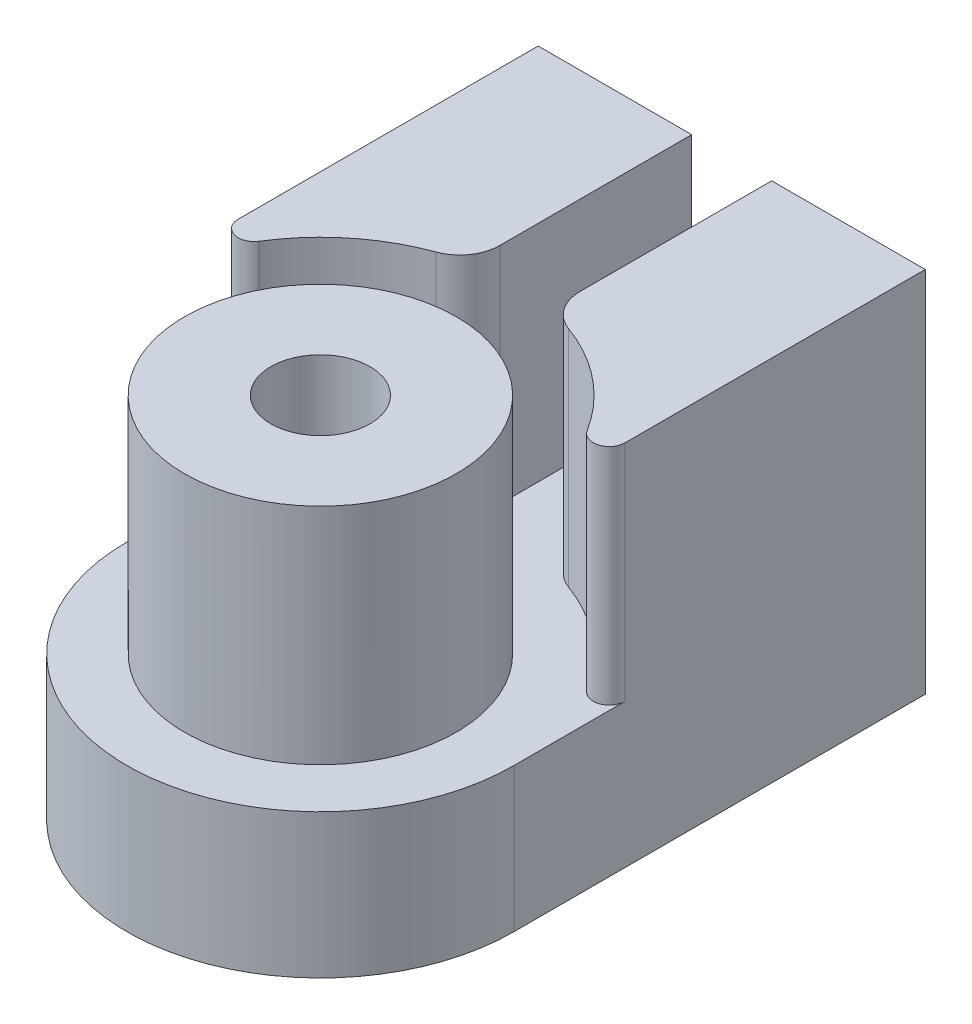
ISO-10303-21;
HEADER;
FILE_DESCRIPTION(('STEP AP214'),'2;1');
FILE_NAME('part.step','',(''),(''),'','','');
FILE_SCHEMA(('AUTOMOTIVE_DESIGN { 1 0 10303 214 1 1 1 1 }'));
ENDSEC;
DATA;
#1=APPLICATION_CONTEXT('core data for automotive mechanical design processes');
#2=APPLICATION_PROTOCOL_DEFINITION('international standard','automotive_design',2000,#1);
#3=PRODUCT_CONTEXT('',#1,'mechanical');
#4=PRODUCT('Part','Part','',(#3));
#5=PRODUCT_RELATED_PRODUCT_CATEGORY('part','',(#4));
#6=PRODUCT_DEFINITION_FORMATION('','',#4);
#7=PRODUCT_DEFINITION_CONTEXT('part definition',#1,'design');
#8=PRODUCT_DEFINITION('design','',#6,#7);
#9=PRODUCT_DEFINITION_SHAPE('','',#8);
#10=(LENGTH_UNIT() NAMED_UNIT(*) SI_UNIT(.MILLI.,.METRE.));
#11=(NAMED_UNIT(*) PLANE_ANGLE_UNIT() SI_UNIT($,.RADIAN.));
#12=(NAMED_UNIT(*) SI_UNIT($,.STERADIAN.) SOLID_ANGLE_UNIT());
#13=UNCERTAINTY_MEASURE_WITH_UNIT(LENGTH_MEASURE(1.E-05),#10,'distance_accuracy_value','');
#14=(GEOMETRIC_REPRESENTATION_CONTEXT(3) GLOBAL_UNCERTAINTY_ASSIGNED_CONTEXT((#13)) GLOBAL_UNIT_ASSIGNED_CONTEXT((#10,
#11,#12)) REPRESENTATION_CONTEXT('',''));
#15=CARTESIAN_POINT('',(0.,0.,0.));
#16=DIRECTION('',(0.,0.,1.));
#17=DIRECTION('',(1.,0.,0.));
#18=AXIS2_PLACEMENT_3D('',#15,#16,#17);
#19=CARTESIAN_POINT('',(-2.5,7.,-6.8585712797929));
#20=DIRECTION('',(0.,-1.,0.));
#21=DIRECTION('',(0.,0.,-1.));
#22=AXIS2_PLACEMENT_3D('',#19,#20,#21);
#23=CYLINDRICAL_SURFACE('',#22,1.25);
#24=CARTESIAN_POINT('',(-2.5,0.,-6.8585712797929));
#25=DIRECTION('',(0.,1.,0.));
#26=DIRECTION('',(0.,0.,1.));
#27=AXIS2_PLACEMENT_3D('',#24,#25,#26);
#28=CIRCLE('',#27,1.25);
#29=CARTESIAN_POINT('',(-1.25,0.,-6.8585712797929));
#30=VERTEX_POINT('',#29);
#31=CARTESIAN_POINT('',(-2.07191780821918,0.,-5.6841583894174));
#32=VERTEX_POINT('',#31);
#33=EDGE_CURVE('E241',#30,#32,#28,.F.);
#34=ORIENTED_EDGE('',*,*,#33,.F.);
#35=DIRECTION('',(0.,-1.,0.));
#36=VECTOR('',#35,1.);
#37=CARTESIAN_POINT('',(-1.25,7.,-6.8585712797929));
#38=LINE('',#37,#36);
#39=CARTESIAN_POINT('',(-1.25,7.,-6.8585712797929));
#40=VERTEX_POINT('',#39);
#41=EDGE_CURVE('E270',#40,#30,#38,.T.);
#42=ORIENTED_EDGE('',*,*,#41,.F.);
#43=CARTESIAN_POINT('',(-2.5,7.,-6.8585712797929));
#44=DIRECTION('',(0.,1.,0.));
#45=DIRECTION('',(0.,0.,1.));
#46=AXIS2_PLACEMENT_3D('',#43,#44,#45);
#47=CIRCLE('',#46,1.25);
#48=CARTESIAN_POINT('',(-2.07191780821918,7.,-5.6841583894174));
#49=VERTEX_POINT('',#48);
#50=EDGE_CURVE('E242',#40,#49,#47,.F.);
#51=ORIENTED_EDGE('',*,*,#50,.T.);
#52=DIRECTION('',(0.,-1.,0.));
#53=VECTOR('',#52,1.);
#54=CARTESIAN_POINT('',(-2.07191780821918,7.,-5.6841583894174));
#55=LINE('',#54,#53);
#56=EDGE_CURVE('E256',#49,#32,#55,.T.);
#57=ORIENTED_EDGE('',*,*,#56,.T.);
#58=EDGE_LOOP('',(#34,#42,#51,#57));
#59=FACE_BOUND('',#58,.T.);
#60=ADVANCED_FACE('F72',(#59),#23,.T.);
#61=CARTESIAN_POINT('',(-1.25,7.,0.));
#62=DIRECTION('',(-1.,0.,0.));
#63=DIRECTION('',(0.,0.,1.));
#64=AXIS2_PLACEMENT_3D('',#61,#62,#63);
#65=PLANE('',#64);
#66=DIRECTION('',(0.,0.,-1.));
#67=VECTOR('',#66,1.);
#68=CARTESIAN_POINT('',(-1.25,0.,0.));
#69=LINE('',#68,#67);
#70=CARTESIAN_POINT('',(-1.25,0.,-12.8585712797929));
#71=VERTEX_POINT('',#70);
#72=EDGE_CURVE('E258',#30,#71,#69,.T.);
#73=ORIENTED_EDGE('',*,*,#72,.T.);
#74=DIRECTION('',(0.,-1.,0.));
#75=VECTOR('',#74,1.);
#76=CARTESIAN_POINT('',(-1.25,7.,-12.8585712797929));
#77=LINE('',#76,#75);
#78=CARTESIAN_POINT('',(-1.25,7.,-12.8585712797929));
#79=VERTEX_POINT('',#78);
#80=EDGE_CURVE('E267',#79,#71,#77,.T.);
#81=ORIENTED_EDGE('',*,*,#80,.F.);
#82=DIRECTION('',(0.,0.,-1.));
#83=VECTOR('',#82,1.);
#84=CARTESIAN_POINT('',(-1.25,7.,0.));
#85=LINE('',#84,#83);
#86=EDGE_CURVE('E245',#40,#79,#85,.T.);
#87=ORIENTED_EDGE('',*,*,#86,.F.);
#88=ORIENTED_EDGE('',*,*,#41,.T.);
#89=EDGE_LOOP('',(#73,#81,#87,#88));
#90=FACE_BOUND('',#89,.T.);
#91=ADVANCED_FACE('F325',(#90),#65,.F.);
#92=CARTESIAN_POINT('',(0.,7.,-12.8585712797929));
#93=DIRECTION('',(0.,0.,-1.));
#94=DIRECTION('',(-1.,0.,0.));
#95=AXIS2_PLACEMENT_3D('',#92,#93,#94);
#96=PLANE('',#95);
#97=ORIENTED_EDGE('',*,*,#80,.T.);
#98=DIRECTION('',(1.,0.,0.));
#99=VECTOR('',#98,1.);
#100=CARTESIAN_POINT('',(0.,0.,-12.8585712797929));
#101=LINE('',#100,#99);
#102=CARTESIAN_POINT('',(1.25,0.,-12.8585712797929));
#103=VERTEX_POINT('',#102);
#104=EDGE_CURVE('E182',#71,#103,#101,.T.);
#105=ORIENTED_EDGE('',*,*,#104,.T.);
#106=DIRECTION('',(0.,-1.,0.));
#107=VECTOR('',#106,1.);
#108=CARTESIAN_POINT('',(1.25,7.,-12.8585712797929));
#109=LINE('',#108,#107);
#110=CARTESIAN_POINT('',(1.25,7.,-12.8585712797929));
#111=VERTEX_POINT('',#110);
#112=EDGE_CURVE('E208',#111,#103,#109,.T.);
#113=ORIENTED_EDGE('',*,*,#112,.F.);
#114=DIRECTION('',(1.,0.,0.));
#115=VECTOR('',#114,1.);
#116=CARTESIAN_POINT('',(0.,7.,-12.8585712797929));
#117=LINE('',#116,#115);
#118=CARTESIAN_POINT('',(6.05,7.,-12.8585712797929));
#119=VERTEX_POINT('',#118);
#120=EDGE_CURVE('E195',#111,#119,#117,.T.);
#121=ORIENTED_EDGE('',*,*,#120,.T.);
#122=DIRECTION('',(0.,1.,0.));
#123=VECTOR('',#122,1.);
#124=CARTESIAN_POINT('',(6.05,-4.5,-12.8585712797929));
#125=LINE('',#124,#123);
#126=CARTESIAN_POINT('',(6.05,-4.5,-12.8585712797929));
#127=VERTEX_POINT('',#126);
#128=EDGE_CURVE('E238',#127,#119,#125,.T.);
#129=ORIENTED_EDGE('',*,*,#128,.F.);
#130=DIRECTION('',(1.,0.,0.));
#131=VECTOR('',#130,1.);
#132=CARTESIAN_POINT('',(0.,-4.5,-12.8585712797929));
#133=LINE('',#132,#131);
#134=CARTESIAN_POINT('',(-6.05,-4.5,-12.8585712797929));
#135=VERTEX_POINT('',#134);
#136=EDGE_CURVE('E213',#135,#127,#133,.T.);
#137=ORIENTED_EDGE('',*,*,#136,.F.);
#138=DIRECTION('',(0.,-1.,0.));
#139=VECTOR('',#138,1.);
#140=CARTESIAN_POINT('',(-6.05,7.,-12.8585712797929));
#141=LINE('',#140,#139);
#142=CARTESIAN_POINT('',(-6.05,7.,-12.8585712797929));
#143=VERTEX_POINT('',#142);
#144=EDGE_CURVE('E265',#143,#135,#141,.T.);
#145=ORIENTED_EDGE('',*,*,#144,.F.);
#146=DIRECTION('',(1.,0.,0.));
#147=VECTOR('',#146,1.);
#148=CARTESIAN_POINT('',(0.,7.,-12.8585712797929));
#149=LINE('',#148,#147);
#150=EDGE_CURVE('E248',#143,#79,#149,.T.);
#151=ORIENTED_EDGE('',*,*,#150,.T.);
#152=EDGE_LOOP('',(#97,#105,#113,#121,#129,#137,#145,#151));
#153=FACE_BOUND('',#152,.T.);
#154=ADVANCED_FACE('F313',(#153),#96,.T.);
#155=CARTESIAN_POINT('',(-6.05,7.,0.));
#156=DIRECTION('',(-1.,0.,0.));
#157=DIRECTION('',(0.,0.,1.));
#158=AXIS2_PLACEMENT_3D('',#155,#156,#157);
#159=PLANE('',#158);
#160=DIRECTION('',(0.,1.,0.));
#161=VECTOR('',#160,1.);
#162=CARTESIAN_POINT('',(-6.05,-4.5,0.));
#163=LINE('',#162,#161);
#164=CARTESIAN_POINT('',(-6.05,-4.5,0.));
#165=VERTEX_POINT('',#164);
#166=CARTESIAN_POINT('',(-6.05,0.,0.));
#167=VERTEX_POINT('',#166);
#168=EDGE_CURVE('E228',#165,#167,#163,.T.);
#169=ORIENTED_EDGE('',*,*,#168,.T.);
#170=DIRECTION('',(0.,0.,-1.));
#171=VECTOR('',#170,1.);
#172=CARTESIAN_POINT('',(-6.05,0.,0.));
#173=LINE('',#172,#171);
#174=CARTESIAN_POINT('',(-6.05,0.,-3.47850542618522));
#175=VERTEX_POINT('',#174);
#176=EDGE_CURVE('E281',#167,#175,#173,.T.);
#177=ORIENTED_EDGE('',*,*,#176,.T.);
#178=DIRECTION('',(0.,-1.,0.));
#179=VECTOR('',#178,1.);
#180=CARTESIAN_POINT('',(-6.05,7.,-3.47850542618522));
#181=LINE('',#180,#179);
#182=CARTESIAN_POINT('',(-6.05,7.,-3.47850542618522));
#183=VERTEX_POINT('',#182);
#184=EDGE_CURVE('E279',#175,#183,#181,.F.);
#185=ORIENTED_EDGE('',*,*,#184,.T.);
#186=DIRECTION('',(0.,0.,-1.));
#187=VECTOR('',#186,1.);
#188=CARTESIAN_POINT('',(-6.05,7.,0.));
#189=LINE('',#188,#187);
#190=EDGE_CURVE('E251',#183,#143,#189,.T.);
#191=ORIENTED_EDGE('',*,*,#190,.T.);
#192=ORIENTED_EDGE('',*,*,#144,.T.);
#193=DIRECTION('',(0.,0.,-1.));
#194=VECTOR('',#193,1.);
#195=CARTESIAN_POINT('',(-6.05,-4.5,0.));
#196=LINE('',#195,#194);
#197=EDGE_CURVE('E222',#165,#135,#196,.T.);
#198=ORIENTED_EDGE('',*,*,#197,.F.);
#199=EDGE_LOOP('',(#169,#177,#185,#191,#192,#198));
#200=FACE_BOUND('',#199,.T.);
#201=ADVANCED_FACE('F360',(#200),#159,.T.);
#202=CARTESIAN_POINT('',(0.,7.,0.));
#203=DIRECTION('',(0.,-1.,0.));
#204=DIRECTION('',(0.,0.,-1.));
#205=AXIS2_PLACEMENT_3D('',#202,#203,#204);
#206=CYLINDRICAL_SURFACE('',#205,6.05);
#207=CARTESIAN_POINT('',(0.,7.,0.));
#208=DIRECTION('',(0.,1.,0.));
#209=DIRECTION('',(0.,0.,1.));
#210=AXIS2_PLACEMENT_3D('',#207,#208,#209);
#211=CIRCLE('',#210,6.05);
#212=CARTESIAN_POINT('',(-5.1263358778626,7.,-3.21297066082757));
#213=VERTEX_POINT('',#212);
#214=EDGE_CURVE('E253',#49,#213,#211,.T.);
#215=ORIENTED_EDGE('',*,*,#214,.T.);
#216=DIRECTION('',(0.,-1.,0.));
#217=VECTOR('',#216,1.);
#218=CARTESIAN_POINT('',(-5.1263358778626,7.,-3.21297066082757));
#219=LINE('',#218,#217);
#220=CARTESIAN_POINT('',(-5.1263358778626,0.,-3.21297066082757));
#221=VERTEX_POINT('',#220);
#222=EDGE_CURVE('E276',#213,#221,#219,.T.);
#223=ORIENTED_EDGE('',*,*,#222,.T.);
#224=CARTESIAN_POINT('',(0.,0.,0.));
#225=DIRECTION('',(0.,1.,0.));
#226=DIRECTION('',(0.,0.,1.));
#227=AXIS2_PLACEMENT_3D('',#224,#225,#226);
#228=CIRCLE('',#227,6.05);
#229=EDGE_CURVE('E246',#32,#221,#228,.T.);
#230=ORIENTED_EDGE('',*,*,#229,.F.);
#231=ORIENTED_EDGE('',*,*,#56,.F.);
#232=EDGE_LOOP('',(#215,#223,#230,#231));
#233=FACE_BOUND('',#232,.T.);
#234=ADVANCED_FACE('F355',(#233),#206,.F.);
#235=CARTESIAN_POINT('',(0.,7.,0.));
#236=DIRECTION('',(0.,1.,0.));
#237=DIRECTION('',(0.,0.,1.));
#238=AXIS2_PLACEMENT_3D('',#235,#236,#237);
#239=PLANE('',#238);
#240=ORIENTED_EDGE('',*,*,#190,.F.);
#241=CARTESIAN_POINT('',(-5.55,7.,-3.47850542618522));
#242=DIRECTION('',(0.,1.,0.));
#243=DIRECTION('',(0.,0.,1.));
#244=AXIS2_PLACEMENT_3D('',#241,#242,#243);
#245=CIRCLE('',#244,0.5);
#246=EDGE_CURVE('E284',#183,#213,#245,.T.);
#247=ORIENTED_EDGE('',*,*,#246,.T.);
#248=ORIENTED_EDGE('',*,*,#214,.F.);
#249=ORIENTED_EDGE('',*,*,#50,.F.);
#250=ORIENTED_EDGE('',*,*,#86,.T.);
#251=ORIENTED_EDGE('',*,*,#150,.F.);
#252=EDGE_LOOP('',(#240,#247,#248,#249,#250,#251));
#253=FACE_BOUND('',#252,.T.);
#254=ADVANCED_FACE('F351',(#253),#239,.T.);
#255=CARTESIAN_POINT('',(0.,0.,0.));
#256=DIRECTION('',(0.,-1.,0.));
#257=DIRECTION('',(0.,0.,-1.));
#258=AXIS2_PLACEMENT_3D('',#255,#256,#257);
#259=PLANE('',#258);
#260=CARTESIAN_POINT('',(0.,0.,0.));
#261=DIRECTION('',(0.,-1.,0.));
#262=DIRECTION('',(0.,0.,-1.));
#263=AXIS2_PLACEMENT_3D('',#260,#261,#262);
#264=CIRCLE('',#263,4.25);
#265=CARTESIAN_POINT('',(0.,0.,-4.25));
#266=VERTEX_POINT('',#265);
#267=EDGE_CURVE('E273',#266,#266,#264,.F.);
#268=ORIENTED_EDGE('',*,*,#267,.F.);
#269=EDGE_LOOP('',(#268));
#270=FACE_BOUND('',#269,.T.);
#271=CARTESIAN_POINT('',(2.5,0.,-6.8585712797929));
#272=DIRECTION('',(0.,1.,0.));
#273=DIRECTION('',(0.,0.,1.));
#274=AXIS2_PLACEMENT_3D('',#271,#272,#273);
#275=CIRCLE('',#274,1.25);
#276=CARTESIAN_POINT('',(1.25,0.,-6.8585712797929));
#277=VERTEX_POINT('',#276);
#278=CARTESIAN_POINT('',(2.07191780821918,0.,-5.6841583894174));
#279=VERTEX_POINT('',#278);
#280=EDGE_CURVE('E198',#277,#279,#275,.T.);
#281=ORIENTED_EDGE('',*,*,#280,.F.);
#282=DIRECTION('',(0.,0.,-1.));
#283=VECTOR('',#282,1.);
#284=CARTESIAN_POINT('',(1.25,0.,0.));
#285=LINE('',#284,#283);
#286=EDGE_CURVE('E178',#277,#103,#285,.T.);
#287=ORIENTED_EDGE('',*,*,#286,.T.);
#288=ORIENTED_EDGE('',*,*,#104,.F.);
#289=ORIENTED_EDGE('',*,*,#72,.F.);
#290=ORIENTED_EDGE('',*,*,#33,.T.);
#291=ORIENTED_EDGE('',*,*,#229,.T.);
#292=CARTESIAN_POINT('',(-5.55,0.,-3.47850542618522));
#293=DIRECTION('',(0.,-1.,0.));
#294=DIRECTION('',(0.,0.,-1.));
#295=AXIS2_PLACEMENT_3D('',#292,#293,#294);
#296=CIRCLE('',#295,0.5);
#297=EDGE_CURVE('E286',#221,#175,#296,.T.);
#298=ORIENTED_EDGE('',*,*,#297,.T.);
#299=ORIENTED_EDGE('',*,*,#176,.F.);
#300=CARTESIAN_POINT('',(0.,0.,0.));
#301=DIRECTION('',(0.,-1.,0.));
#302=DIRECTION('',(0.,0.,-1.));
#303=AXIS2_PLACEMENT_3D('',#300,#301,#302);
#304=CIRCLE('',#303,6.05);
#305=CARTESIAN_POINT('',(6.05,0.,0.));
#306=VERTEX_POINT('',#305);
#307=EDGE_CURVE('E217',#167,#306,#304,.F.);
#308=ORIENTED_EDGE('',*,*,#307,.T.);
#309=DIRECTION('',(0.,0.,1.));
#310=VECTOR('',#309,1.);
#311=CARTESIAN_POINT('',(6.05,0.,0.));
#312=LINE('',#311,#310);
#313=CARTESIAN_POINT('',(6.05,0.,-3.47850542618522));
#314=VERTEX_POINT('',#313);
#315=EDGE_CURVE('E288',#314,#306,#312,.T.);
#316=ORIENTED_EDGE('',*,*,#315,.F.);
#317=CARTESIAN_POINT('',(5.55,0.,-3.47850542618522));
#318=DIRECTION('',(0.,-1.,0.));
#319=DIRECTION('',(0.,0.,-1.));
#320=AXIS2_PLACEMENT_3D('',#317,#318,#319);
#321=CIRCLE('',#320,0.5);
#322=CARTESIAN_POINT('',(5.1263358778626,0.,-3.21297066082757));
#323=VERTEX_POINT('',#322);
#324=EDGE_CURVE('E12',#314,#323,#321,.T.);
#325=ORIENTED_EDGE('',*,*,#324,.T.);
#326=CARTESIAN_POINT('',(0.,0.,0.));
#327=DIRECTION('',(0.,1.,0.));
#328=DIRECTION('',(0.,0.,1.));
#329=AXIS2_PLACEMENT_3D('',#326,#327,#328);
#330=CIRCLE('',#329,6.05);
#331=EDGE_CURVE('E196',#323,#279,#330,.T.);
#332=ORIENTED_EDGE('',*,*,#331,.T.);
#333=EDGE_LOOP('',(#281,#287,#288,#289,#290,#291,#298,#299,#308,#316,#325,#332));
#334=FACE_BOUND('',#333,.T.);
#335=ADVANCED_FACE('F300',(#270,#334),#259,.F.);
#336=CARTESIAN_POINT('',(6.05,-4.5,0.));
#337=DIRECTION('',(-1.,0.,0.));
#338=DIRECTION('',(0.,0.,1.));
#339=AXIS2_PLACEMENT_3D('',#336,#337,#338);
#340=PLANE('',#339);
#341=DIRECTION('',(0.,0.,-1.));
#342=VECTOR('',#341,1.);
#343=CARTESIAN_POINT('',(6.05,7.,0.));
#344=LINE('',#343,#342);
#345=CARTESIAN_POINT('',(6.05,7.,-3.47850542618522));
#346=VERTEX_POINT('',#345);
#347=EDGE_CURVE('E205',#346,#119,#344,.T.);
#348=ORIENTED_EDGE('',*,*,#347,.F.);
#349=DIRECTION('',(0.,1.,0.));
#350=VECTOR('',#349,1.);
#351=CARTESIAN_POINT('',(6.05,0.,-3.47850542618522));
#352=LINE('',#351,#350);
#353=EDGE_CURVE('E290',#346,#314,#352,.F.);
#354=ORIENTED_EDGE('',*,*,#353,.T.);
#355=ORIENTED_EDGE('',*,*,#315,.T.);
#356=DIRECTION('',(0.,1.,0.));
#357=VECTOR('',#356,1.);
#358=CARTESIAN_POINT('',(6.05,-4.5,0.));
#359=LINE('',#358,#357);
#360=CARTESIAN_POINT('',(6.05,-4.5,0.));
#361=VERTEX_POINT('',#360);
#362=EDGE_CURVE('E235',#361,#306,#359,.T.);
#363=ORIENTED_EDGE('',*,*,#362,.F.);
#364=DIRECTION('',(0.,0.,1.));
#365=VECTOR('',#364,1.);
#366=CARTESIAN_POINT('',(6.05,-4.5,0.));
#367=LINE('',#366,#365);
#368=EDGE_CURVE('E216',#127,#361,#367,.T.);
#369=ORIENTED_EDGE('',*,*,#368,.F.);
#370=ORIENTED_EDGE('',*,*,#128,.T.);
#371=EDGE_LOOP('',(#348,#354,#355,#363,#369,#370));
#372=FACE_BOUND('',#371,.T.);
#373=ADVANCED_FACE('F298',(#372),#340,.F.);
#374=CARTESIAN_POINT('',(0.,-4.5,0.));
#375=DIRECTION('',(0.,1.,0.));
#376=DIRECTION('',(0.,0.,1.));
#377=AXIS2_PLACEMENT_3D('',#374,#375,#376);
#378=CYLINDRICAL_SURFACE('',#377,6.05);
#379=ORIENTED_EDGE('',*,*,#307,.F.);
#380=ORIENTED_EDGE('',*,*,#168,.F.);
#381=CARTESIAN_POINT('',(0.,-4.5,0.));
#382=DIRECTION('',(0.,-1.,0.));
#383=DIRECTION('',(0.,0.,-1.));
#384=AXIS2_PLACEMENT_3D('',#381,#382,#383);
#385=CIRCLE('',#384,6.05);
#386=EDGE_CURVE('E219',#165,#361,#385,.F.);
#387=ORIENTED_EDGE('',*,*,#386,.T.);
#388=ORIENTED_EDGE('',*,*,#362,.T.);
#389=EDGE_LOOP('',(#379,#380,#387,#388));
#390=FACE_BOUND('',#389,.T.);
#391=ADVANCED_FACE('F304',(#390),#378,.T.);
#392=CARTESIAN_POINT('',(0.,-4.5,0.));
#393=DIRECTION('',(0.,1.,0.));
#394=DIRECTION('',(0.,0.,1.));
#395=AXIS2_PLACEMENT_3D('',#392,#393,#394);
#396=CYLINDRICAL_SURFACE('',#395,1.55);
#397=CARTESIAN_POINT('',(0.,-4.5,0.));
#398=DIRECTION('',(0.,-1.,0.));
#399=DIRECTION('',(0.,0.,-1.));
#400=AXIS2_PLACEMENT_3D('',#397,#398,#399);
#401=CIRCLE('',#400,1.55);
#402=CARTESIAN_POINT('',(0.,-4.5,-1.55));
#403=VERTEX_POINT('',#402);
#404=EDGE_CURVE('E225',#403,#403,#401,.T.);
#405=ORIENTED_EDGE('',*,*,#404,.T.);
#406=EDGE_LOOP('',(#405));
#407=FACE_BOUND('',#406,.T.);
#408=CARTESIAN_POINT('',(0.,7.,0.));
#409=DIRECTION('',(0.,1.,0.));
#410=DIRECTION('',(0.,0.,1.));
#411=AXIS2_PLACEMENT_3D('',#408,#409,#410);
#412=CIRCLE('',#411,1.55);
#413=CARTESIAN_POINT('',(0.,7.,1.55));
#414=VERTEX_POINT('',#413);
#415=EDGE_CURVE('E577',#414,#414,#412,.T.);
#416=ORIENTED_EDGE('',*,*,#415,.T.);
#417=EDGE_LOOP('',(#416));
#418=FACE_BOUND('',#417,.T.);
#419=ADVANCED_FACE('F375',(#407,#418),#396,.F.);
#420=CARTESIAN_POINT('',(0.,-4.5,0.));
#421=DIRECTION('',(0.,-1.,0.));
#422=DIRECTION('',(0.,0.,-1.));
#423=AXIS2_PLACEMENT_3D('',#420,#421,#422);
#424=PLANE('',#423);
#425=ORIENTED_EDGE('',*,*,#136,.T.);
#426=ORIENTED_EDGE('',*,*,#368,.T.);
#427=ORIENTED_EDGE('',*,*,#386,.F.);
#428=ORIENTED_EDGE('',*,*,#197,.T.);
#429=EDGE_LOOP('',(#425,#426,#427,#428));
#430=FACE_BOUND('',#429,.T.);
#431=ORIENTED_EDGE('',*,*,#404,.F.);
#432=EDGE_LOOP('',(#431));
#433=FACE_BOUND('',#432,.T.);
#434=ADVANCED_FACE('F308',(#430,#433),#424,.T.);
#435=CARTESIAN_POINT('',(1.25,7.,0.));
#436=DIRECTION('',(-1.,0.,0.));
#437=DIRECTION('',(0.,0.,1.));
#438=AXIS2_PLACEMENT_3D('',#435,#436,#437);
#439=PLANE('',#438);
#440=ORIENTED_EDGE('',*,*,#286,.F.);
#441=DIRECTION('',(0.,-1.,0.));
#442=VECTOR('',#441,1.);
#443=CARTESIAN_POINT('',(1.25,7.,-6.8585712797929));
#444=LINE('',#443,#442);
#445=CARTESIAN_POINT('',(1.25,7.,-6.8585712797929));
#446=VERTEX_POINT('',#445);
#447=EDGE_CURVE('E171',#446,#277,#444,.T.);
#448=ORIENTED_EDGE('',*,*,#447,.F.);
#449=DIRECTION('',(0.,0.,-1.));
#450=VECTOR('',#449,1.);
#451=CARTESIAN_POINT('',(1.25,7.,0.));
#452=LINE('',#451,#450);
#453=EDGE_CURVE('E175',#446,#111,#452,.T.);
#454=ORIENTED_EDGE('',*,*,#453,.T.);
#455=ORIENTED_EDGE('',*,*,#112,.T.);
#456=EDGE_LOOP('',(#440,#448,#454,#455));
#457=FACE_BOUND('',#456,.T.);
#458=ADVANCED_FACE('F173',(#457),#439,.T.);
#459=CARTESIAN_POINT('',(2.5,7.,-6.8585712797929));
#460=DIRECTION('',(0.,-1.,0.));
#461=DIRECTION('',(0.,0.,-1.));
#462=AXIS2_PLACEMENT_3D('',#459,#460,#461);
#463=CYLINDRICAL_SURFACE('',#462,1.25);
#464=ORIENTED_EDGE('',*,*,#280,.T.);
#465=DIRECTION('',(0.,-1.,0.));
#466=VECTOR('',#465,1.);
#467=CARTESIAN_POINT('',(2.07191780821918,7.,-5.6841583894174));
#468=LINE('',#467,#466);
#469=CARTESIAN_POINT('',(2.07191780821918,7.,-5.6841583894174));
#470=VERTEX_POINT('',#469);
#471=EDGE_CURVE('E183',#470,#279,#468,.T.);
#472=ORIENTED_EDGE('',*,*,#471,.F.);
#473=CARTESIAN_POINT('',(2.5,7.,-6.8585712797929));
#474=DIRECTION('',(0.,1.,0.));
#475=DIRECTION('',(0.,0.,1.));
#476=AXIS2_PLACEMENT_3D('',#473,#474,#475);
#477=CIRCLE('',#476,1.25);
#478=EDGE_CURVE('E187',#446,#470,#477,.T.);
#479=ORIENTED_EDGE('',*,*,#478,.F.);
#480=ORIENTED_EDGE('',*,*,#447,.T.);
#481=EDGE_LOOP('',(#464,#472,#479,#480));
#482=FACE_BOUND('',#481,.T.);
#483=ADVANCED_FACE('F188',(#482),#463,.T.);
#484=CARTESIAN_POINT('',(0.,7.,0.));
#485=DIRECTION('',(0.,-1.,0.));
#486=DIRECTION('',(0.,0.,-1.));
#487=AXIS2_PLACEMENT_3D('',#484,#485,#486);
#488=CYLINDRICAL_SURFACE('',#487,6.05);
#489=ORIENTED_EDGE('',*,*,#331,.F.);
#490=DIRECTION('',(0.,-1.,0.));
#491=VECTOR('',#490,1.);
#492=CARTESIAN_POINT('',(5.1263358778626,7.,-3.21297066082757));
#493=LINE('',#492,#491);
#494=CARTESIAN_POINT('',(5.1263358778626,7.,-3.21297066082757));
#495=VERTEX_POINT('',#494);
#496=EDGE_CURVE('E87',#323,#495,#493,.F.);
#497=ORIENTED_EDGE('',*,*,#496,.T.);
#498=CARTESIAN_POINT('',(0.,7.,0.));
#499=DIRECTION('',(0.,1.,0.));
#500=DIRECTION('',(0.,0.,1.));
#501=AXIS2_PLACEMENT_3D('',#498,#499,#500);
#502=CIRCLE('',#501,6.05);
#503=EDGE_CURVE('E191',#495,#470,#502,.T.);
#504=ORIENTED_EDGE('',*,*,#503,.T.);
#505=ORIENTED_EDGE('',*,*,#471,.T.);
#506=EDGE_LOOP('',(#489,#497,#504,#505));
#507=FACE_BOUND('',#506,.T.);
#508=ADVANCED_FACE('F314',(#507),#488,.F.);
#509=CARTESIAN_POINT('',(0.,7.,0.));
#510=DIRECTION('',(0.,1.,0.));
#511=DIRECTION('',(0.,0.,1.));
#512=AXIS2_PLACEMENT_3D('',#509,#510,#511);
#513=PLANE('',#512);
#514=ORIENTED_EDGE('',*,*,#503,.F.);
#515=CARTESIAN_POINT('',(5.55,7.,-3.47850542618522));
#516=DIRECTION('',(0.,1.,0.));
#517=DIRECTION('',(0.,0.,1.));
#518=AXIS2_PLACEMENT_3D('',#515,#516,#517);
#519=CIRCLE('',#518,0.5);
#520=EDGE_CURVE('E80',#495,#346,#519,.T.);
#521=ORIENTED_EDGE('',*,*,#520,.T.);
#522=ORIENTED_EDGE('',*,*,#347,.T.);
#523=ORIENTED_EDGE('',*,*,#120,.F.);
#524=ORIENTED_EDGE('',*,*,#453,.F.);
#525=ORIENTED_EDGE('',*,*,#478,.T.);
#526=EDGE_LOOP('',(#514,#521,#522,#523,#524,#525));
#527=FACE_BOUND('',#526,.T.);
#528=ADVANCED_FACE('F193',(#527),#513,.T.);
#529=CARTESIAN_POINT('',(0.,7.,0.));
#530=DIRECTION('',(0.,-1.,0.));
#531=DIRECTION('',(0.,0.,-1.));
#532=AXIS2_PLACEMENT_3D('',#529,#530,#531);
#533=CYLINDRICAL_SURFACE('',#532,4.25);
#534=CARTESIAN_POINT('',(0.,7.,0.));
#535=DIRECTION('',(0.,1.,0.));
#536=DIRECTION('',(0.,0.,1.));
#537=AXIS2_PLACEMENT_3D('',#534,#535,#536);
#538=CIRCLE('',#537,4.25);
#539=CARTESIAN_POINT('',(0.,7.,4.25));
#540=VERTEX_POINT('',#539);
#541=EDGE_CURVE('E201',#540,#540,#538,.T.);
#542=ORIENTED_EDGE('',*,*,#541,.F.);
#543=EDGE_LOOP('',(#542));
#544=FACE_BOUND('',#543,.T.);
#545=ORIENTED_EDGE('',*,*,#267,.T.);
#546=EDGE_LOOP('',(#545));
#547=FACE_BOUND('',#546,.T.);
#548=ADVANCED_FACE('F321',(#544,#547),#533,.T.);
#549=CARTESIAN_POINT('',(0.,7.,0.));
#550=DIRECTION('',(0.,1.,0.));
#551=DIRECTION('',(0.,0.,1.));
#552=AXIS2_PLACEMENT_3D('',#549,#550,#551);
#553=PLANE('',#552);
#554=ORIENTED_EDGE('',*,*,#415,.F.);
#555=EDGE_LOOP('',(#554));
#556=FACE_BOUND('',#555,.T.);
#557=ORIENTED_EDGE('',*,*,#541,.T.);
#558=EDGE_LOOP('',(#557));
#559=FACE_BOUND('',#558,.T.);
#560=ADVANCED_FACE('F337',(#556,#559),#553,.T.);
#561=CARTESIAN_POINT('',(-5.55,7.,-3.47850542618522));
#562=DIRECTION('',(0.,-1.,0.));
#563=DIRECTION('',(0.,0.,-1.));
#564=AXIS2_PLACEMENT_3D('',#561,#562,#563);
#565=CYLINDRICAL_SURFACE('',#564,0.5);
#566=ORIENTED_EDGE('',*,*,#246,.F.);
#567=ORIENTED_EDGE('',*,*,#184,.F.);
#568=ORIENTED_EDGE('',*,*,#297,.F.);
#569=ORIENTED_EDGE('',*,*,#222,.F.);
#570=EDGE_LOOP('',(#566,#567,#568,#569));
#571=FACE_BOUND('',#570,.T.);
#572=ADVANCED_FACE('F335',(#571),#565,.T.);
#573=CARTESIAN_POINT('',(5.55,7.,-3.47850542618522));
#574=DIRECTION('',(0.,-1.,0.));
#575=DIRECTION('',(0.,0.,-1.));
#576=AXIS2_PLACEMENT_3D('',#573,#574,#575);
#577=CYLINDRICAL_SURFACE('',#576,0.5);
#578=ORIENTED_EDGE('',*,*,#520,.F.);
#579=ORIENTED_EDGE('',*,*,#496,.F.);
#580=ORIENTED_EDGE('',*,*,#324,.F.);
#581=ORIENTED_EDGE('',*,*,#353,.F.);
#582=EDGE_LOOP('',(#578,#579,#580,#581));
#583=FACE_BOUND('',#582,.T.);
#584=ADVANCED_FACE('F74',(#583),#577,.T.);
#585=CLOSED_SHELL('',(#60,#91,#154,#201,#234,#254,#335,#373,#391,#419,#434,#458,#483,#508,#528,
#548,#560,#572,#584));
#586=MANIFOLD_SOLID_BREP('B2',#585);
#587=ADVANCED_BREP_SHAPE_REPRESENTATION('',(#18,#586),#14);
#588=SHAPE_DEFINITION_REPRESENTATION(#9,#587);
ENDSEC;
END-ISO-10303-21;
